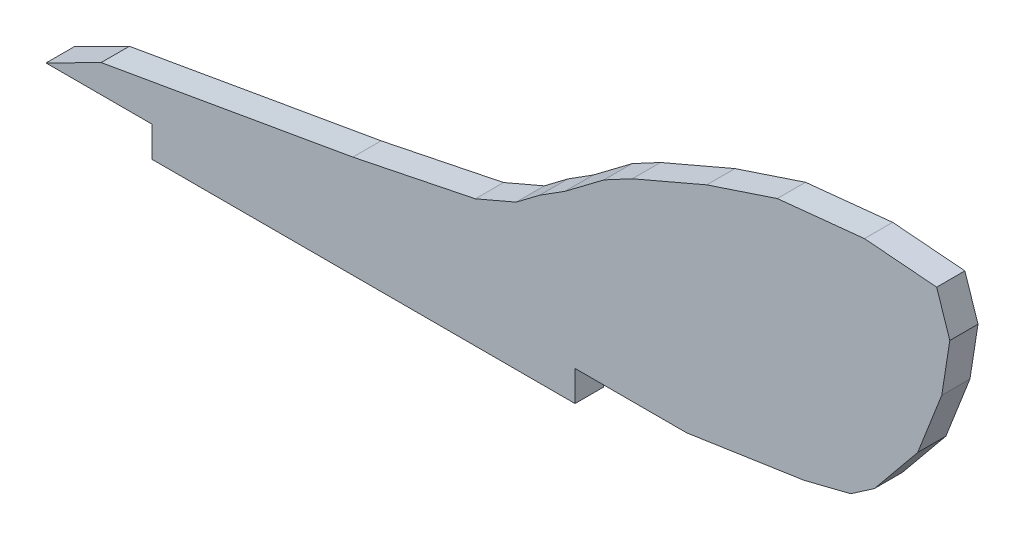
ISO-10303-21;
HEADER;
FILE_DESCRIPTION(('STEP AP214'),'2;1');
FILE_NAME('part.step','',(''),(''),'','','');
FILE_SCHEMA(('AUTOMOTIVE_DESIGN { 1 0 10303 214 1 1 1 1 }'));
ENDSEC;
DATA;
#1=APPLICATION_CONTEXT('core data for automotive mechanical design processes');
#2=APPLICATION_PROTOCOL_DEFINITION('international standard','automotive_design',2000,#1);
#3=PRODUCT_CONTEXT('',#1,'mechanical');
#4=PRODUCT('Part','Part','',(#3));
#5=PRODUCT_RELATED_PRODUCT_CATEGORY('part','',(#4));
#6=PRODUCT_DEFINITION_FORMATION('','',#4);
#7=PRODUCT_DEFINITION_CONTEXT('part definition',#1,'design');
#8=PRODUCT_DEFINITION('design','',#6,#7);
#9=PRODUCT_DEFINITION_SHAPE('','',#8);
#10=(LENGTH_UNIT() NAMED_UNIT(*) SI_UNIT(.MILLI.,.METRE.));
#11=(NAMED_UNIT(*) PLANE_ANGLE_UNIT() SI_UNIT($,.RADIAN.));
#12=(NAMED_UNIT(*) SI_UNIT($,.STERADIAN.) SOLID_ANGLE_UNIT());
#13=UNCERTAINTY_MEASURE_WITH_UNIT(LENGTH_MEASURE(1.E-05),#10,'distance_accuracy_value','');
#14=(GEOMETRIC_REPRESENTATION_CONTEXT(3) GLOBAL_UNCERTAINTY_ASSIGNED_CONTEXT((#13)) GLOBAL_UNIT_ASSIGNED_CONTEXT((#10,
#11,#12)) REPRESENTATION_CONTEXT('',''));
#15=CARTESIAN_POINT('',(0.,0.,0.));
#16=DIRECTION('',(0.,0.,1.));
#17=DIRECTION('',(1.,0.,0.));
#18=AXIS2_PLACEMENT_3D('',#15,#16,#17);
#19=CARTESIAN_POINT('',(0.,0.,5.08));
#20=DIRECTION('',(0.,1.,0.));
#21=DIRECTION('',(0.,0.,1.));
#22=AXIS2_PLACEMENT_3D('',#19,#20,#21);
#23=PLANE('',#22);
#24=DIRECTION('',(1.,0.,0.));
#25=VECTOR('',#24,1.);
#26=CARTESIAN_POINT('',(0.,0.,0.));
#27=LINE('',#26,#25);
#28=CARTESIAN_POINT('',(0.,0.,0.));
#29=VERTEX_POINT('',#28);
#30=CARTESIAN_POINT('',(19.0754,0.,0.));
#31=VERTEX_POINT('',#30);
#32=EDGE_CURVE('E225',#29,#31,#27,.T.);
#33=ORIENTED_EDGE('',*,*,#32,.T.);
#34=DIRECTION('',(0.,0.,-1.));
#35=VECTOR('',#34,1.);
#36=CARTESIAN_POINT('',(19.0754,0.,5.08));
#37=LINE('',#36,#35);
#38=CARTESIAN_POINT('',(19.0754,0.,5.08));
#39=VERTEX_POINT('',#38);
#40=EDGE_CURVE('E11',#39,#31,#37,.T.);
#41=ORIENTED_EDGE('',*,*,#40,.F.);
#42=DIRECTION('',(1.,0.,0.));
#43=VECTOR('',#42,1.);
#44=CARTESIAN_POINT('',(0.,0.,5.08));
#45=LINE('',#44,#43);
#46=CARTESIAN_POINT('',(0.,0.,5.08));
#47=VERTEX_POINT('',#46);
#48=EDGE_CURVE('E271',#47,#39,#45,.T.);
#49=ORIENTED_EDGE('',*,*,#48,.F.);
#50=DIRECTION('',(0.,0.,-1.));
#51=VECTOR('',#50,1.);
#52=CARTESIAN_POINT('',(0.,0.,5.08));
#53=LINE('',#52,#51);
#54=EDGE_CURVE('E221',#47,#29,#53,.T.);
#55=ORIENTED_EDGE('',*,*,#54,.T.);
#56=EDGE_LOOP('',(#33,#41,#49,#55));
#57=FACE_BOUND('',#56,.T.);
#58=ADVANCED_FACE('F33',(#57),#23,.F.);
#59=CARTESIAN_POINT('',(19.0754,0.,5.08));
#60=DIRECTION('',(1.,0.,0.));
#61=DIRECTION('',(0.,0.,-1.));
#62=AXIS2_PLACEMENT_3D('',#59,#60,#61);
#63=PLANE('',#62);
#64=DIRECTION('',(0.,-1.,0.));
#65=VECTOR('',#64,1.);
#66=CARTESIAN_POINT('',(19.0754,0.,0.));
#67=LINE('',#66,#65);
#68=CARTESIAN_POINT('',(19.0754,-5.4864,0.));
#69=VERTEX_POINT('',#68);
#70=EDGE_CURVE('E228',#31,#69,#67,.T.);
#71=ORIENTED_EDGE('',*,*,#70,.T.);
#72=DIRECTION('',(0.,0.,-1.));
#73=VECTOR('',#72,1.);
#74=CARTESIAN_POINT('',(19.0754,-5.4864,5.08));
#75=LINE('',#74,#73);
#76=CARTESIAN_POINT('',(19.0754,-5.4864,5.08));
#77=VERTEX_POINT('',#76);
#78=EDGE_CURVE('E41',#77,#69,#75,.T.);
#79=ORIENTED_EDGE('',*,*,#78,.F.);
#80=DIRECTION('',(0.,-1.,0.));
#81=VECTOR('',#80,1.);
#82=CARTESIAN_POINT('',(19.0754,0.,5.08));
#83=LINE('',#82,#81);
#84=EDGE_CURVE('E140',#39,#77,#83,.T.);
#85=ORIENTED_EDGE('',*,*,#84,.F.);
#86=ORIENTED_EDGE('',*,*,#40,.T.);
#87=EDGE_LOOP('',(#71,#79,#85,#86));
#88=FACE_BOUND('',#87,.T.);
#89=ADVANCED_FACE('F409',(#88),#63,.F.);
#90=CARTESIAN_POINT('',(19.0754,-5.4864,5.08));
#91=DIRECTION('',(0.,1.,0.));
#92=DIRECTION('',(0.,0.,1.));
#93=AXIS2_PLACEMENT_3D('',#90,#91,#92);
#94=PLANE('',#93);
#95=DIRECTION('',(1.,0.,0.));
#96=VECTOR('',#95,1.);
#97=CARTESIAN_POINT('',(19.0754,-5.4864,0.));
#98=LINE('',#97,#96);
#99=CARTESIAN_POINT('',(95.2754,-5.4864,0.));
#100=VERTEX_POINT('',#99);
#101=EDGE_CURVE('E230',#69,#100,#98,.T.);
#102=ORIENTED_EDGE('',*,*,#101,.T.);
#103=DIRECTION('',(0.,0.,-1.));
#104=VECTOR('',#103,1.);
#105=CARTESIAN_POINT('',(95.2754,-5.4864,5.08));
#106=LINE('',#105,#104);
#107=CARTESIAN_POINT('',(95.2754,-5.4864,5.08));
#108=VERTEX_POINT('',#107);
#109=EDGE_CURVE('E326',#108,#100,#106,.T.);
#110=ORIENTED_EDGE('',*,*,#109,.F.);
#111=DIRECTION('',(1.,0.,0.));
#112=VECTOR('',#111,1.);
#113=CARTESIAN_POINT('',(19.0754,-5.4864,5.08));
#114=LINE('',#113,#112);
#115=EDGE_CURVE('E334',#77,#108,#114,.T.);
#116=ORIENTED_EDGE('',*,*,#115,.F.);
#117=ORIENTED_EDGE('',*,*,#78,.T.);
#118=EDGE_LOOP('',(#102,#110,#116,#117));
#119=FACE_BOUND('',#118,.T.);
#120=ADVANCED_FACE('F332',(#119),#94,.F.);
#121=CARTESIAN_POINT('',(95.2754,-5.4864,5.08));
#122=DIRECTION('',(-1.,0.,0.));
#123=DIRECTION('',(0.,0.,1.));
#124=AXIS2_PLACEMENT_3D('',#121,#122,#123);
#125=PLANE('',#124);
#126=DIRECTION('',(0.,1.,0.));
#127=VECTOR('',#126,1.);
#128=CARTESIAN_POINT('',(95.2754,-5.4864,0.));
#129=LINE('',#128,#127);
#130=CARTESIAN_POINT('',(95.2754,0.,0.));
#131=VERTEX_POINT('',#130);
#132=EDGE_CURVE('E232',#100,#131,#129,.T.);
#133=ORIENTED_EDGE('',*,*,#132,.T.);
#134=DIRECTION('',(0.,0.,-1.));
#135=VECTOR('',#134,1.);
#136=CARTESIAN_POINT('',(95.2754,0.,5.08));
#137=LINE('',#136,#135);
#138=CARTESIAN_POINT('',(95.2754,0.,5.08));
#139=VERTEX_POINT('',#138);
#140=EDGE_CURVE('E323',#139,#131,#137,.T.);
#141=ORIENTED_EDGE('',*,*,#140,.F.);
#142=DIRECTION('',(0.,1.,0.));
#143=VECTOR('',#142,1.);
#144=CARTESIAN_POINT('',(95.2754,-5.4864,5.08));
#145=LINE('',#144,#143);
#146=EDGE_CURVE('E352',#108,#139,#145,.T.);
#147=ORIENTED_EDGE('',*,*,#146,.F.);
#148=ORIENTED_EDGE('',*,*,#109,.T.);
#149=EDGE_LOOP('',(#133,#141,#147,#148));
#150=FACE_BOUND('',#149,.T.);
#151=ADVANCED_FACE('F343',(#150),#125,.F.);
#152=CARTESIAN_POINT('',(95.2754,0.,5.08));
#153=DIRECTION('',(0.,1.,0.));
#154=DIRECTION('',(0.,0.,1.));
#155=AXIS2_PLACEMENT_3D('',#152,#153,#154);
#156=PLANE('',#155);
#157=DIRECTION('',(1.,0.,0.));
#158=VECTOR('',#157,1.);
#159=CARTESIAN_POINT('',(95.2754,0.,0.));
#160=LINE('',#159,#158);
#161=CARTESIAN_POINT('',(115.3922,0.,0.));
#162=VERTEX_POINT('',#161);
#163=EDGE_CURVE('E234',#131,#162,#160,.T.);
#164=ORIENTED_EDGE('',*,*,#163,.T.);
#165=DIRECTION('',(0.,0.,-1.));
#166=VECTOR('',#165,1.);
#167=CARTESIAN_POINT('',(115.3922,0.,5.08));
#168=LINE('',#167,#166);
#169=CARTESIAN_POINT('',(115.3922,0.,5.08));
#170=VERTEX_POINT('',#169);
#171=EDGE_CURVE('E320',#170,#162,#168,.T.);
#172=ORIENTED_EDGE('',*,*,#171,.F.);
#173=DIRECTION('',(1.,0.,0.));
#174=VECTOR('',#173,1.);
#175=CARTESIAN_POINT('',(95.2754,0.,5.08));
#176=LINE('',#175,#174);
#177=EDGE_CURVE('E349',#139,#170,#176,.T.);
#178=ORIENTED_EDGE('',*,*,#177,.F.);
#179=ORIENTED_EDGE('',*,*,#140,.T.);
#180=EDGE_LOOP('',(#164,#172,#178,#179));
#181=FACE_BOUND('',#180,.T.);
#182=ADVANCED_FACE('F347',(#181),#156,.F.);
#183=CARTESIAN_POINT('',(136.5504,3.175,5.08));
#184=DIRECTION('',(-0.148398505879888,0.988927643183573,0.));
#185=DIRECTION('',(-0.988927643183573,-0.148398505879888,0.));
#186=AXIS2_PLACEMENT_3D('',#183,#184,#185);
#187=PLANE('',#186);
#188=DIRECTION('',(0.988927643183573,0.148398505879888,0.));
#189=VECTOR('',#188,1.);
#190=CARTESIAN_POINT('',(136.5504,3.175,0.));
#191=LINE('',#190,#189);
#192=CARTESIAN_POINT('',(136.5504,3.175,0.));
#193=VERTEX_POINT('',#192);
#194=EDGE_CURVE('E236',#162,#193,#191,.T.);
#195=ORIENTED_EDGE('',*,*,#194,.T.);
#196=DIRECTION('',(0.,0.,-1.));
#197=VECTOR('',#196,1.);
#198=CARTESIAN_POINT('',(136.5504,3.175,5.08));
#199=LINE('',#198,#197);
#200=CARTESIAN_POINT('',(136.5504,3.175,5.08));
#201=VERTEX_POINT('',#200);
#202=EDGE_CURVE('E317',#201,#193,#199,.T.);
#203=ORIENTED_EDGE('',*,*,#202,.F.);
#204=DIRECTION('',(0.988927643183573,0.148398505879888,0.));
#205=VECTOR('',#204,1.);
#206=CARTESIAN_POINT('',(136.5504,3.175,5.08));
#207=LINE('',#206,#205);
#208=EDGE_CURVE('E351',#170,#201,#207,.T.);
#209=ORIENTED_EDGE('',*,*,#208,.F.);
#210=ORIENTED_EDGE('',*,*,#171,.T.);
#211=EDGE_LOOP('',(#195,#203,#209,#210));
#212=FACE_BOUND('',#211,.T.);
#213=ADVANCED_FACE('F422',(#212),#187,.F.);
#214=CARTESIAN_POINT('',(144.9324,5.2832,5.08));
#215=DIRECTION('',(-0.243918331587152,0.969795776189884,0.));
#216=DIRECTION('',(-0.969795776189884,-0.243918331587153,0.));
#217=AXIS2_PLACEMENT_3D('',#214,#215,#216);
#218=PLANE('',#217);
#219=DIRECTION('',(0.969795776189884,0.243918331587153,0.));
#220=VECTOR('',#219,1.);
#221=CARTESIAN_POINT('',(144.9324,5.2832,0.));
#222=LINE('',#221,#220);
#223=CARTESIAN_POINT('',(144.9324,5.2832,0.));
#224=VERTEX_POINT('',#223);
#225=EDGE_CURVE('E238',#193,#224,#222,.T.);
#226=ORIENTED_EDGE('',*,*,#225,.T.);
#227=DIRECTION('',(0.,0.,-1.));
#228=VECTOR('',#227,1.);
#229=CARTESIAN_POINT('',(144.9324,5.2832,5.08));
#230=LINE('',#229,#228);
#231=CARTESIAN_POINT('',(144.9324,5.2832,5.08));
#232=VERTEX_POINT('',#231);
#233=EDGE_CURVE('E314',#232,#224,#230,.T.);
#234=ORIENTED_EDGE('',*,*,#233,.F.);
#235=DIRECTION('',(0.969795776189884,0.243918331587153,0.));
#236=VECTOR('',#235,1.);
#237=CARTESIAN_POINT('',(144.9324,5.2832,5.08));
#238=LINE('',#237,#236);
#239=EDGE_CURVE('E354',#201,#232,#238,.T.);
#240=ORIENTED_EDGE('',*,*,#239,.F.);
#241=ORIENTED_EDGE('',*,*,#202,.T.);
#242=EDGE_LOOP('',(#226,#234,#240,#241));
#243=FACE_BOUND('',#242,.T.);
#244=ADVANCED_FACE('F425',(#243),#218,.F.);
#245=CARTESIAN_POINT('',(149.1742,8.2042,5.08));
#246=DIRECTION('',(-0.567156579430481,0.823609989259914,0.));
#247=DIRECTION('',(-0.823609989259914,-0.567156579430481,0.));
#248=AXIS2_PLACEMENT_3D('',#245,#246,#247);
#249=PLANE('',#248);
#250=DIRECTION('',(0.823609989259914,0.567156579430481,0.));
#251=VECTOR('',#250,1.);
#252=CARTESIAN_POINT('',(149.1742,8.2042,0.));
#253=LINE('',#252,#251);
#254=CARTESIAN_POINT('',(149.1742,8.2042,0.));
#255=VERTEX_POINT('',#254);
#256=EDGE_CURVE('E240',#224,#255,#253,.T.);
#257=ORIENTED_EDGE('',*,*,#256,.T.);
#258=DIRECTION('',(0.,0.,-1.));
#259=VECTOR('',#258,1.);
#260=CARTESIAN_POINT('',(149.1742,8.2042,5.08));
#261=LINE('',#260,#259);
#262=CARTESIAN_POINT('',(149.1742,8.2042,5.08));
#263=VERTEX_POINT('',#262);
#264=EDGE_CURVE('E311',#263,#255,#261,.T.);
#265=ORIENTED_EDGE('',*,*,#264,.F.);
#266=DIRECTION('',(0.823609989259914,0.567156579430481,0.));
#267=VECTOR('',#266,1.);
#268=CARTESIAN_POINT('',(149.1742,8.2042,5.08));
#269=LINE('',#268,#267);
#270=EDGE_CURVE('E360',#232,#263,#269,.T.);
#271=ORIENTED_EDGE('',*,*,#270,.F.);
#272=ORIENTED_EDGE('',*,*,#233,.T.);
#273=EDGE_LOOP('',(#257,#265,#271,#272));
#274=FACE_BOUND('',#273,.T.);
#275=ADVANCED_FACE('F429',(#274),#249,.F.);
#276=CARTESIAN_POINT('',(156.972,17.7292,5.08));
#277=DIRECTION('',(-0.77377339963111,0.633462489831335,0.));
#278=DIRECTION('',(-0.633462489831335,-0.77377339963111,0.));
#279=AXIS2_PLACEMENT_3D('',#276,#277,#278);
#280=PLANE('',#279);
#281=DIRECTION('',(0.633462489831335,0.77377339963111,0.));
#282=VECTOR('',#281,1.);
#283=CARTESIAN_POINT('',(156.972,17.7292,0.));
#284=LINE('',#283,#282);
#285=CARTESIAN_POINT('',(156.972,17.7292,0.));
#286=VERTEX_POINT('',#285);
#287=EDGE_CURVE('E242',#255,#286,#284,.T.);
#288=ORIENTED_EDGE('',*,*,#287,.T.);
#289=DIRECTION('',(0.,0.,-1.));
#290=VECTOR('',#289,1.);
#291=CARTESIAN_POINT('',(156.972,17.7292,5.08));
#292=LINE('',#291,#290);
#293=CARTESIAN_POINT('',(156.972,17.7292,5.08));
#294=VERTEX_POINT('',#293);
#295=EDGE_CURVE('E308',#294,#286,#292,.T.);
#296=ORIENTED_EDGE('',*,*,#295,.F.);
#297=DIRECTION('',(0.633462489831335,0.77377339963111,0.));
#298=VECTOR('',#297,1.);
#299=CARTESIAN_POINT('',(156.972,17.7292,5.08));
#300=LINE('',#299,#298);
#301=EDGE_CURVE('E362',#263,#294,#300,.T.);
#302=ORIENTED_EDGE('',*,*,#301,.F.);
#303=ORIENTED_EDGE('',*,*,#264,.T.);
#304=EDGE_LOOP('',(#288,#296,#302,#303));
#305=FACE_BOUND('',#304,.T.);
#306=ADVANCED_FACE('F433',(#305),#280,.F.);
#307=CARTESIAN_POINT('',(161.3154,28.829,5.08));
#308=DIRECTION('',(-0.931242779705753,0.364399348580512,0.));
#309=DIRECTION('',(-0.364399348580512,-0.931242779705754,0.));
#310=AXIS2_PLACEMENT_3D('',#307,#308,#309);
#311=PLANE('',#310);
#312=DIRECTION('',(0.364399348580512,0.931242779705754,0.));
#313=VECTOR('',#312,1.);
#314=CARTESIAN_POINT('',(161.3154,28.829,0.));
#315=LINE('',#314,#313);
#316=CARTESIAN_POINT('',(161.3154,28.829,0.));
#317=VERTEX_POINT('',#316);
#318=EDGE_CURVE('E244',#286,#317,#315,.T.);
#319=ORIENTED_EDGE('',*,*,#318,.T.);
#320=DIRECTION('',(0.,0.,-1.));
#321=VECTOR('',#320,1.);
#322=CARTESIAN_POINT('',(161.3154,28.829,5.08));
#323=LINE('',#322,#321);
#324=CARTESIAN_POINT('',(161.3154,28.829,5.08));
#325=VERTEX_POINT('',#324);
#326=EDGE_CURVE('E305',#325,#317,#323,.T.);
#327=ORIENTED_EDGE('',*,*,#326,.F.);
#328=DIRECTION('',(0.364399348580512,0.931242779705754,0.));
#329=VECTOR('',#328,1.);
#330=CARTESIAN_POINT('',(161.3154,28.829,5.08));
#331=LINE('',#330,#329);
#332=EDGE_CURVE('E364',#294,#325,#331,.T.);
#333=ORIENTED_EDGE('',*,*,#332,.F.);
#334=ORIENTED_EDGE('',*,*,#295,.T.);
#335=EDGE_LOOP('',(#319,#327,#333,#334));
#336=FACE_BOUND('',#335,.T.);
#337=ADVANCED_FACE('F437',(#336),#311,.F.);
#338=CARTESIAN_POINT('',(162.7632,38.1,5.08));
#339=DIRECTION('',(-0.9880249326723,0.154294304554304,0.));
#340=DIRECTION('',(-0.154294304554304,-0.9880249326723,0.));
#341=AXIS2_PLACEMENT_3D('',#338,#339,#340);
#342=PLANE('',#341);
#343=DIRECTION('',(0.154294304554304,0.9880249326723,0.));
#344=VECTOR('',#343,1.);
#345=CARTESIAN_POINT('',(162.7632,38.1,0.));
#346=LINE('',#345,#344);
#347=CARTESIAN_POINT('',(162.7632,38.1,0.));
#348=VERTEX_POINT('',#347);
#349=EDGE_CURVE('E246',#317,#348,#346,.T.);
#350=ORIENTED_EDGE('',*,*,#349,.T.);
#351=DIRECTION('',(0.,0.,-1.));
#352=VECTOR('',#351,1.);
#353=CARTESIAN_POINT('',(162.7632,38.1,5.08));
#354=LINE('',#353,#352);
#355=CARTESIAN_POINT('',(162.7632,38.1,5.08));
#356=VERTEX_POINT('',#355);
#357=EDGE_CURVE('E302',#356,#348,#354,.T.);
#358=ORIENTED_EDGE('',*,*,#357,.F.);
#359=DIRECTION('',(0.154294304554304,0.9880249326723,0.));
#360=VECTOR('',#359,1.);
#361=CARTESIAN_POINT('',(162.7632,38.1,5.08));
#362=LINE('',#361,#360);
#363=EDGE_CURVE('E366',#325,#356,#362,.T.);
#364=ORIENTED_EDGE('',*,*,#363,.F.);
#365=ORIENTED_EDGE('',*,*,#326,.T.);
#366=EDGE_LOOP('',(#350,#358,#364,#365));
#367=FACE_BOUND('',#366,.T.);
#368=ADVANCED_FACE('F441',(#367),#342,.F.);
#369=CARTESIAN_POINT('',(160.400999981411,45.2374000015249,5.08));
#370=DIRECTION('',(-0.949356830446367,-0.314199949848544,0.));
#371=DIRECTION('',(0.314199949848544,-0.949356830446367,0.));
#372=AXIS2_PLACEMENT_3D('',#369,#370,#371);
#373=PLANE('',#372);
#374=DIRECTION('',(-0.314199949848544,0.949356830446367,0.));
#375=VECTOR('',#374,1.);
#376=CARTESIAN_POINT('',(160.400999981411,45.2374000015249,0.));
#377=LINE('',#376,#375);
#378=CARTESIAN_POINT('',(160.400999981411,45.2374000015249,0.));
#379=VERTEX_POINT('',#378);
#380=EDGE_CURVE('E248',#348,#379,#377,.T.);
#381=ORIENTED_EDGE('',*,*,#380,.T.);
#382=DIRECTION('',(0.,0.,-1.));
#383=VECTOR('',#382,1.);
#384=CARTESIAN_POINT('',(160.400999981411,45.2374000015249,5.08));
#385=LINE('',#384,#383);
#386=CARTESIAN_POINT('',(160.400999981411,45.2374000015249,5.08));
#387=VERTEX_POINT('',#386);
#388=EDGE_CURVE('E299',#387,#379,#385,.T.);
#389=ORIENTED_EDGE('',*,*,#388,.F.);
#390=DIRECTION('',(-0.314199949848544,0.949356830446367,0.));
#391=VECTOR('',#390,1.);
#392=CARTESIAN_POINT('',(160.400999981411,45.2374000015249,5.08));
#393=LINE('',#392,#391);
#394=EDGE_CURVE('E368',#356,#387,#393,.T.);
#395=ORIENTED_EDGE('',*,*,#394,.F.);
#396=ORIENTED_EDGE('',*,*,#357,.T.);
#397=EDGE_LOOP('',(#381,#389,#395,#396));
#398=FACE_BOUND('',#397,.T.);
#399=ADVANCED_FACE('F445',(#398),#373,.F.);
#400=CARTESIAN_POINT('',(147.3962,46.3042,5.08));
#401=DIRECTION('',(-0.0817566358526895,-0.996652322775626,0.));
#402=DIRECTION('',(0.996652322775626,-0.0817566358526895,0.));
#403=AXIS2_PLACEMENT_3D('',#400,#401,#402);
#404=PLANE('',#403);
#405=DIRECTION('',(-0.996652322775626,0.0817566358526894,0.));
#406=VECTOR('',#405,1.);
#407=CARTESIAN_POINT('',(147.3962,46.3042,0.));
#408=LINE('',#407,#406);
#409=CARTESIAN_POINT('',(147.3962,46.3042,0.));
#410=VERTEX_POINT('',#409);
#411=EDGE_CURVE('E250',#379,#410,#408,.T.);
#412=ORIENTED_EDGE('',*,*,#411,.T.);
#413=DIRECTION('',(0.,0.,-1.));
#414=VECTOR('',#413,1.);
#415=CARTESIAN_POINT('',(147.3962,46.3042,5.08));
#416=LINE('',#415,#414);
#417=CARTESIAN_POINT('',(147.3962,46.3042,5.08));
#418=VERTEX_POINT('',#417);
#419=EDGE_CURVE('E296',#418,#410,#416,.T.);
#420=ORIENTED_EDGE('',*,*,#419,.F.);
#421=DIRECTION('',(-0.996652322775626,0.0817566358526894,0.));
#422=VECTOR('',#421,1.);
#423=CARTESIAN_POINT('',(147.3962,46.3042,5.08));
#424=LINE('',#423,#422);
#425=EDGE_CURVE('E370',#387,#418,#424,.T.);
#426=ORIENTED_EDGE('',*,*,#425,.F.);
#427=ORIENTED_EDGE('',*,*,#388,.T.);
#428=EDGE_LOOP('',(#412,#420,#426,#427));
#429=FACE_BOUND('',#428,.T.);
#430=ADVANCED_FACE('F449',(#429),#404,.F.);
#431=CARTESIAN_POINT('',(131.699,44.704,5.08));
#432=DIRECTION('',(0.101416145203864,-0.994844091047431,0.));
#433=DIRECTION('',(0.994844091047431,0.101416145203864,0.));
#434=AXIS2_PLACEMENT_3D('',#431,#432,#433);
#435=PLANE('',#434);
#436=DIRECTION('',(-0.994844091047431,-0.101416145203864,0.));
#437=VECTOR('',#436,1.);
#438=CARTESIAN_POINT('',(131.699,44.704,0.));
#439=LINE('',#438,#437);
#440=CARTESIAN_POINT('',(131.699,44.704,0.));
#441=VERTEX_POINT('',#440);
#442=EDGE_CURVE('E252',#410,#441,#439,.T.);
#443=ORIENTED_EDGE('',*,*,#442,.T.);
#444=DIRECTION('',(0.,0.,-1.));
#445=VECTOR('',#444,1.);
#446=CARTESIAN_POINT('',(131.699,44.704,5.08));
#447=LINE('',#446,#445);
#448=CARTESIAN_POINT('',(131.699,44.704,5.08));
#449=VERTEX_POINT('',#448);
#450=EDGE_CURVE('E293',#449,#441,#447,.T.);
#451=ORIENTED_EDGE('',*,*,#450,.F.);
#452=DIRECTION('',(-0.994844091047431,-0.101416145203864,0.));
#453=VECTOR('',#452,1.);
#454=CARTESIAN_POINT('',(131.699,44.704,5.08));
#455=LINE('',#454,#453);
#456=EDGE_CURVE('E372',#418,#449,#455,.T.);
#457=ORIENTED_EDGE('',*,*,#456,.F.);
#458=ORIENTED_EDGE('',*,*,#419,.T.);
#459=EDGE_LOOP('',(#443,#451,#457,#458));
#460=FACE_BOUND('',#459,.T.);
#461=ADVANCED_FACE('F453',(#460),#435,.F.);
#462=CARTESIAN_POINT('',(118.999,40.4876,5.08));
#463=DIRECTION('',(0.315088663463618,-0.949062239348248,0.));
#464=DIRECTION('',(0.949062239348248,0.315088663463618,0.));
#465=AXIS2_PLACEMENT_3D('',#462,#463,#464);
#466=PLANE('',#465);
#467=DIRECTION('',(-0.949062239348248,-0.315088663463618,0.));
#468=VECTOR('',#467,1.);
#469=CARTESIAN_POINT('',(118.999,40.4876,0.));
#470=LINE('',#469,#468);
#471=CARTESIAN_POINT('',(118.999,40.4876,0.));
#472=VERTEX_POINT('',#471);
#473=EDGE_CURVE('E254',#441,#472,#470,.T.);
#474=ORIENTED_EDGE('',*,*,#473,.T.);
#475=DIRECTION('',(0.,0.,-1.));
#476=VECTOR('',#475,1.);
#477=CARTESIAN_POINT('',(118.999,40.4876,5.08));
#478=LINE('',#477,#476);
#479=CARTESIAN_POINT('',(118.999,40.4876,5.08));
#480=VERTEX_POINT('',#479);
#481=EDGE_CURVE('E290',#480,#472,#478,.T.);
#482=ORIENTED_EDGE('',*,*,#481,.F.);
#483=DIRECTION('',(-0.949062239348248,-0.315088663463618,0.));
#484=VECTOR('',#483,1.);
#485=CARTESIAN_POINT('',(118.999,40.4876,5.08));
#486=LINE('',#485,#484);
#487=EDGE_CURVE('E374',#449,#480,#486,.T.);
#488=ORIENTED_EDGE('',*,*,#487,.F.);
#489=ORIENTED_EDGE('',*,*,#450,.T.);
#490=EDGE_LOOP('',(#474,#482,#488,#489));
#491=FACE_BOUND('',#490,.T.);
#492=ADVANCED_FACE('F457',(#491),#466,.F.);
#493=CARTESIAN_POINT('',(105.590652807882,34.7345375369458,5.08));
#494=DIRECTION('',(0.3943030408389,-0.918980474213243,0.));
#495=DIRECTION('',(0.918980474213243,0.3943030408389,0.));
#496=AXIS2_PLACEMENT_3D('',#493,#494,#495);
#497=PLANE('',#496);
#498=DIRECTION('',(-0.918980474213243,-0.3943030408389,0.));
#499=VECTOR('',#498,1.);
#500=CARTESIAN_POINT('',(105.590652807882,34.7345375369458,0.));
#501=LINE('',#500,#499);
#502=CARTESIAN_POINT('',(105.590652807882,34.7345375369458,0.));
#503=VERTEX_POINT('',#502);
#504=EDGE_CURVE('E256',#472,#503,#501,.T.);
#505=ORIENTED_EDGE('',*,*,#504,.T.);
#506=DIRECTION('',(0.,0.,-1.));
#507=VECTOR('',#506,1.);
#508=CARTESIAN_POINT('',(105.590652807882,34.7345375369458,5.08));
#509=LINE('',#508,#507);
#510=CARTESIAN_POINT('',(105.590652807882,34.7345375369458,5.08));
#511=VERTEX_POINT('',#510);
#512=EDGE_CURVE('E287',#511,#503,#509,.T.);
#513=ORIENTED_EDGE('',*,*,#512,.F.);
#514=DIRECTION('',(-0.918980474213243,-0.3943030408389,0.));
#515=VECTOR('',#514,1.);
#516=CARTESIAN_POINT('',(105.590652807882,34.7345375369458,5.08));
#517=LINE('',#516,#515);
#518=EDGE_CURVE('E376',#480,#511,#517,.T.);
#519=ORIENTED_EDGE('',*,*,#518,.F.);
#520=ORIENTED_EDGE('',*,*,#481,.T.);
#521=EDGE_LOOP('',(#505,#513,#519,#520));
#522=FACE_BOUND('',#521,.T.);
#523=ADVANCED_FACE('F461',(#522),#497,.F.);
#524=CARTESIAN_POINT('',(100.4824,32.004,5.08));
#525=DIRECTION('',(0.47141278673879,-0.881912685303465,0.));
#526=DIRECTION('',(0.881912685303465,0.47141278673879,0.));
#527=AXIS2_PLACEMENT_3D('',#524,#525,#526);
#528=PLANE('',#527);
#529=DIRECTION('',(-0.881912685303465,-0.47141278673879,0.));
#530=VECTOR('',#529,1.);
#531=CARTESIAN_POINT('',(100.4824,32.004,0.));
#532=LINE('',#531,#530);
#533=CARTESIAN_POINT('',(100.4824,32.004,0.));
#534=VERTEX_POINT('',#533);
#535=EDGE_CURVE('E258',#503,#534,#532,.T.);
#536=ORIENTED_EDGE('',*,*,#535,.T.);
#537=DIRECTION('',(0.,0.,-1.));
#538=VECTOR('',#537,1.);
#539=CARTESIAN_POINT('',(100.4824,32.004,5.08));
#540=LINE('',#539,#538);
#541=CARTESIAN_POINT('',(100.4824,32.004,5.08));
#542=VERTEX_POINT('',#541);
#543=EDGE_CURVE('E284',#542,#534,#540,.T.);
#544=ORIENTED_EDGE('',*,*,#543,.F.);
#545=DIRECTION('',(-0.881912685303465,-0.47141278673879,0.));
#546=VECTOR('',#545,1.);
#547=CARTESIAN_POINT('',(100.4824,32.004,5.08));
#548=LINE('',#547,#546);
#549=EDGE_CURVE('E378',#511,#542,#548,.T.);
#550=ORIENTED_EDGE('',*,*,#549,.F.);
#551=ORIENTED_EDGE('',*,*,#512,.T.);
#552=EDGE_LOOP('',(#536,#544,#550,#551));
#553=FACE_BOUND('',#552,.T.);
#554=ADVANCED_FACE('F465',(#553),#528,.F.);
#555=CARTESIAN_POINT('',(93.472,26.7208,5.08));
#556=DIRECTION('',(0.601850239386592,-0.798608971493748,0.));
#557=DIRECTION('',(0.798608971493748,0.601850239386592,0.));
#558=AXIS2_PLACEMENT_3D('',#555,#556,#557);
#559=PLANE('',#558);
#560=DIRECTION('',(-0.798608971493748,-0.601850239386592,0.));
#561=VECTOR('',#560,1.);
#562=CARTESIAN_POINT('',(93.472,26.7208,0.));
#563=LINE('',#562,#561);
#564=CARTESIAN_POINT('',(93.472,26.7208,0.));
#565=VERTEX_POINT('',#564);
#566=EDGE_CURVE('E260',#534,#565,#563,.T.);
#567=ORIENTED_EDGE('',*,*,#566,.T.);
#568=DIRECTION('',(0.,0.,-1.));
#569=VECTOR('',#568,1.);
#570=CARTESIAN_POINT('',(93.472,26.7208,5.08));
#571=LINE('',#570,#569);
#572=CARTESIAN_POINT('',(93.472,26.7208,5.08));
#573=VERTEX_POINT('',#572);
#574=EDGE_CURVE('E281',#573,#565,#571,.T.);
#575=ORIENTED_EDGE('',*,*,#574,.F.);
#576=DIRECTION('',(-0.798608971493748,-0.601850239386592,0.));
#577=VECTOR('',#576,1.);
#578=CARTESIAN_POINT('',(93.472,26.7208,5.08));
#579=LINE('',#578,#577);
#580=EDGE_CURVE('E380',#542,#573,#579,.T.);
#581=ORIENTED_EDGE('',*,*,#580,.F.);
#582=ORIENTED_EDGE('',*,*,#543,.T.);
#583=EDGE_LOOP('',(#567,#575,#581,#582));
#584=FACE_BOUND('',#583,.T.);
#585=ADVANCED_FACE('F469',(#584),#559,.F.);
#586=CARTESIAN_POINT('',(88.9,23.8252,5.08));
#587=DIRECTION('',(0.535052081184344,-0.844819075554229,0.));
#588=DIRECTION('',(0.844819075554229,0.535052081184344,0.));
#589=AXIS2_PLACEMENT_3D('',#586,#587,#588);
#590=PLANE('',#589);
#591=DIRECTION('',(-0.844819075554229,-0.535052081184344,0.));
#592=VECTOR('',#591,1.);
#593=CARTESIAN_POINT('',(88.9,23.8252,0.));
#594=LINE('',#593,#592);
#595=CARTESIAN_POINT('',(88.9,23.8252,0.));
#596=VERTEX_POINT('',#595);
#597=EDGE_CURVE('E262',#565,#596,#594,.T.);
#598=ORIENTED_EDGE('',*,*,#597,.T.);
#599=DIRECTION('',(0.,0.,-1.));
#600=VECTOR('',#599,1.);
#601=CARTESIAN_POINT('',(88.9,23.8252,5.08));
#602=LINE('',#601,#600);
#603=CARTESIAN_POINT('',(88.9,23.8252,5.08));
#604=VERTEX_POINT('',#603);
#605=EDGE_CURVE('E278',#604,#596,#602,.T.);
#606=ORIENTED_EDGE('',*,*,#605,.F.);
#607=DIRECTION('',(-0.844819075554229,-0.535052081184344,0.));
#608=VECTOR('',#607,1.);
#609=CARTESIAN_POINT('',(88.9,23.8252,5.08));
#610=LINE('',#609,#608);
#611=EDGE_CURVE('E382',#573,#604,#610,.T.);
#612=ORIENTED_EDGE('',*,*,#611,.F.);
#613=ORIENTED_EDGE('',*,*,#574,.T.);
#614=EDGE_LOOP('',(#598,#606,#612,#613));
#615=FACE_BOUND('',#614,.T.);
#616=ADVANCED_FACE('F473',(#615),#590,.F.);
#617=CARTESIAN_POINT('',(84.6582,20.6248,5.08));
#618=DIRECTION('',(0.602291977899668,-0.798275875470194,0.));
#619=DIRECTION('',(0.798275875470195,0.602291977899668,0.));
#620=AXIS2_PLACEMENT_3D('',#617,#618,#619);
#621=PLANE('',#620);
#622=DIRECTION('',(-0.798275875470194,-0.602291977899668,0.));
#623=VECTOR('',#622,1.);
#624=CARTESIAN_POINT('',(84.6582,20.6248,0.));
#625=LINE('',#624,#623);
#626=CARTESIAN_POINT('',(84.6582,20.6248,0.));
#627=VERTEX_POINT('',#626);
#628=EDGE_CURVE('E264',#596,#627,#625,.T.);
#629=ORIENTED_EDGE('',*,*,#628,.T.);
#630=DIRECTION('',(0.,0.,-1.));
#631=VECTOR('',#630,1.);
#632=CARTESIAN_POINT('',(84.6582,20.6248,5.08));
#633=LINE('',#632,#631);
#634=CARTESIAN_POINT('',(84.6582,20.6248,5.08));
#635=VERTEX_POINT('',#634);
#636=EDGE_CURVE('E275',#635,#627,#633,.T.);
#637=ORIENTED_EDGE('',*,*,#636,.F.);
#638=DIRECTION('',(-0.798275875470194,-0.602291977899668,0.));
#639=VECTOR('',#638,1.);
#640=CARTESIAN_POINT('',(84.6582,20.6248,5.08));
#641=LINE('',#640,#639);
#642=EDGE_CURVE('E384',#604,#635,#641,.T.);
#643=ORIENTED_EDGE('',*,*,#642,.F.);
#644=ORIENTED_EDGE('',*,*,#605,.T.);
#645=EDGE_LOOP('',(#629,#637,#643,#644));
#646=FACE_BOUND('',#645,.T.);
#647=ADVANCED_FACE('F390',(#646),#621,.F.);
#648=CARTESIAN_POINT('',(77.3176,17.4752,5.08));
#649=DIRECTION('',(0.3943030408389,-0.918980474213243,0.));
#650=DIRECTION('',(0.918980474213243,0.3943030408389,0.));
#651=AXIS2_PLACEMENT_3D('',#648,#649,#650);
#652=PLANE('',#651);
#653=DIRECTION('',(-0.918980474213243,-0.3943030408389,0.));
#654=VECTOR('',#653,1.);
#655=CARTESIAN_POINT('',(77.3176,17.4752,0.));
#656=LINE('',#655,#654);
#657=CARTESIAN_POINT('',(77.3176,17.4752,0.));
#658=VERTEX_POINT('',#657);
#659=EDGE_CURVE('E266',#627,#658,#656,.T.);
#660=ORIENTED_EDGE('',*,*,#659,.T.);
#661=DIRECTION('',(0.,0.,-1.));
#662=VECTOR('',#661,1.);
#663=CARTESIAN_POINT('',(77.3176,17.4752,5.08));
#664=LINE('',#663,#662);
#665=CARTESIAN_POINT('',(77.3176,17.4752,5.08));
#666=VERTEX_POINT('',#665);
#667=EDGE_CURVE('E216',#666,#658,#664,.T.);
#668=ORIENTED_EDGE('',*,*,#667,.F.);
#669=DIRECTION('',(-0.918980474213243,-0.3943030408389,0.));
#670=VECTOR('',#669,1.);
#671=CARTESIAN_POINT('',(77.3176,17.4752,5.08));
#672=LINE('',#671,#670);
#673=EDGE_CURVE('E207',#635,#666,#672,.T.);
#674=ORIENTED_EDGE('',*,*,#673,.F.);
#675=ORIENTED_EDGE('',*,*,#636,.T.);
#676=EDGE_LOOP('',(#660,#668,#674,#675));
#677=FACE_BOUND('',#676,.T.);
#678=ADVANCED_FACE('F394',(#677),#652,.F.);
#679=CARTESIAN_POINT('',(55.2704,12.954,5.08));
#680=DIRECTION('',(0.20088860406857,-0.979614091750104,0.));
#681=DIRECTION('',(0.979614091750104,0.20088860406857,0.));
#682=AXIS2_PLACEMENT_3D('',#679,#680,#681);
#683=PLANE('',#682);
#684=DIRECTION('',(-0.979614091750104,-0.20088860406857,0.));
#685=VECTOR('',#684,1.);
#686=CARTESIAN_POINT('',(55.2704,12.954,0.));
#687=LINE('',#686,#685);
#688=CARTESIAN_POINT('',(55.2704,12.954,0.));
#689=VERTEX_POINT('',#688);
#690=EDGE_CURVE('E215',#658,#689,#687,.T.);
#691=ORIENTED_EDGE('',*,*,#690,.T.);
#692=DIRECTION('',(0.,0.,-1.));
#693=VECTOR('',#692,1.);
#694=CARTESIAN_POINT('',(55.2704,12.954,5.08));
#695=LINE('',#694,#693);
#696=CARTESIAN_POINT('',(55.2704,12.954,5.08));
#697=VERTEX_POINT('',#696);
#698=EDGE_CURVE('E212',#697,#689,#695,.T.);
#699=ORIENTED_EDGE('',*,*,#698,.F.);
#700=DIRECTION('',(-0.979614091750104,-0.20088860406857,0.));
#701=VECTOR('',#700,1.);
#702=CARTESIAN_POINT('',(55.2704,12.954,5.08));
#703=LINE('',#702,#701);
#704=EDGE_CURVE('E201',#666,#697,#703,.T.);
#705=ORIENTED_EDGE('',*,*,#704,.F.);
#706=ORIENTED_EDGE('',*,*,#667,.T.);
#707=EDGE_LOOP('',(#691,#699,#705,#706));
#708=FACE_BOUND('',#707,.T.);
#709=ADVANCED_FACE('F213',(#708),#683,.F.);
#710=CARTESIAN_POINT('',(9.9314,5.0292,5.08));
#711=DIRECTION('',(0.17217953103135,-0.985065586188973,0.));
#712=DIRECTION('',(0.985065586188973,0.17217953103135,0.));
#713=AXIS2_PLACEMENT_3D('',#710,#711,#712);
#714=PLANE('',#713);
#715=DIRECTION('',(-0.985065586188973,-0.17217953103135,0.));
#716=VECTOR('',#715,1.);
#717=CARTESIAN_POINT('',(9.9314,5.0292,0.));
#718=LINE('',#717,#716);
#719=CARTESIAN_POINT('',(9.9314,5.0292,0.));
#720=VERTEX_POINT('',#719);
#721=EDGE_CURVE('E126',#689,#720,#718,.T.);
#722=ORIENTED_EDGE('',*,*,#721,.T.);
#723=DIRECTION('',(0.,0.,-1.));
#724=VECTOR('',#723,1.);
#725=CARTESIAN_POINT('',(9.9314,5.0292,5.08));
#726=LINE('',#725,#724);
#727=CARTESIAN_POINT('',(9.9314,5.0292,5.08));
#728=VERTEX_POINT('',#727);
#729=EDGE_CURVE('E217',#728,#720,#726,.T.);
#730=ORIENTED_EDGE('',*,*,#729,.F.);
#731=DIRECTION('',(-0.985065586188973,-0.17217953103135,0.));
#732=VECTOR('',#731,1.);
#733=CARTESIAN_POINT('',(9.9314,5.0292,5.08));
#734=LINE('',#733,#732);
#735=EDGE_CURVE('E205',#697,#728,#734,.T.);
#736=ORIENTED_EDGE('',*,*,#735,.F.);
#737=ORIENTED_EDGE('',*,*,#698,.T.);
#738=EDGE_LOOP('',(#722,#730,#736,#737));
#739=FACE_BOUND('',#738,.T.);
#740=ADVANCED_FACE('F219',(#739),#714,.F.);
#741=CARTESIAN_POINT('',(0.,0.,5.08));
#742=DIRECTION('',(0.451771119587478,-0.892133877569211,0.));
#743=DIRECTION('',(0.892133877569211,0.451771119587478,0.));
#744=AXIS2_PLACEMENT_3D('',#741,#742,#743);
#745=PLANE('',#744);
#746=DIRECTION('',(-0.892133877569211,-0.451771119587478,0.));
#747=VECTOR('',#746,1.);
#748=CARTESIAN_POINT('',(0.,0.,0.));
#749=LINE('',#748,#747);
#750=EDGE_CURVE('E132',#720,#29,#749,.T.);
#751=ORIENTED_EDGE('',*,*,#750,.T.);
#752=ORIENTED_EDGE('',*,*,#54,.F.);
#753=DIRECTION('',(-0.892133877569211,-0.451771119587478,0.));
#754=VECTOR('',#753,1.);
#755=CARTESIAN_POINT('',(0.,0.,5.08));
#756=LINE('',#755,#754);
#757=EDGE_CURVE('E49',#728,#47,#756,.T.);
#758=ORIENTED_EDGE('',*,*,#757,.F.);
#759=ORIENTED_EDGE('',*,*,#729,.T.);
#760=EDGE_LOOP('',(#751,#752,#758,#759));
#761=FACE_BOUND('',#760,.T.);
#762=ADVANCED_FACE('F398',(#761),#745,.F.);
#763=CARTESIAN_POINT('',(0.,0.,5.08));
#764=DIRECTION('',(0.,0.,-1.));
#765=DIRECTION('',(-1.,0.,0.));
#766=AXIS2_PLACEMENT_3D('',#763,#764,#765);
#767=PLANE('',#766);
#768=ORIENTED_EDGE('',*,*,#48,.T.);
#769=ORIENTED_EDGE('',*,*,#84,.T.);
#770=ORIENTED_EDGE('',*,*,#115,.T.);
#771=ORIENTED_EDGE('',*,*,#146,.T.);
#772=ORIENTED_EDGE('',*,*,#177,.T.);
#773=ORIENTED_EDGE('',*,*,#208,.T.);
#774=ORIENTED_EDGE('',*,*,#239,.T.);
#775=ORIENTED_EDGE('',*,*,#270,.T.);
#776=ORIENTED_EDGE('',*,*,#301,.T.);
#777=ORIENTED_EDGE('',*,*,#332,.T.);
#778=ORIENTED_EDGE('',*,*,#363,.T.);
#779=ORIENTED_EDGE('',*,*,#394,.T.);
#780=ORIENTED_EDGE('',*,*,#425,.T.);
#781=ORIENTED_EDGE('',*,*,#456,.T.);
#782=ORIENTED_EDGE('',*,*,#487,.T.);
#783=ORIENTED_EDGE('',*,*,#518,.T.);
#784=ORIENTED_EDGE('',*,*,#549,.T.);
#785=ORIENTED_EDGE('',*,*,#580,.T.);
#786=ORIENTED_EDGE('',*,*,#611,.T.);
#787=ORIENTED_EDGE('',*,*,#642,.T.);
#788=ORIENTED_EDGE('',*,*,#673,.T.);
#789=ORIENTED_EDGE('',*,*,#704,.T.);
#790=ORIENTED_EDGE('',*,*,#735,.T.);
#791=ORIENTED_EDGE('',*,*,#757,.T.);
#792=EDGE_LOOP('',(#768,#769,#770,#771,#772,#773,#774,#775,#776,#777,#778,#779,#780,#781,#782,
#783,#784,#785,#786,#787,#788,#789,#790,#791));
#793=FACE_BOUND('',#792,.T.);
#794=ADVANCED_FACE('F203',(#793),#767,.F.);
#795=CARTESIAN_POINT('',(0.,0.,0.));
#796=DIRECTION('',(0.,0.,-1.));
#797=DIRECTION('',(-1.,0.,0.));
#798=AXIS2_PLACEMENT_3D('',#795,#796,#797);
#799=PLANE('',#798);
#800=ORIENTED_EDGE('',*,*,#32,.F.);
#801=ORIENTED_EDGE('',*,*,#750,.F.);
#802=ORIENTED_EDGE('',*,*,#721,.F.);
#803=ORIENTED_EDGE('',*,*,#690,.F.);
#804=ORIENTED_EDGE('',*,*,#659,.F.);
#805=ORIENTED_EDGE('',*,*,#628,.F.);
#806=ORIENTED_EDGE('',*,*,#597,.F.);
#807=ORIENTED_EDGE('',*,*,#566,.F.);
#808=ORIENTED_EDGE('',*,*,#535,.F.);
#809=ORIENTED_EDGE('',*,*,#504,.F.);
#810=ORIENTED_EDGE('',*,*,#473,.F.);
#811=ORIENTED_EDGE('',*,*,#442,.F.);
#812=ORIENTED_EDGE('',*,*,#411,.F.);
#813=ORIENTED_EDGE('',*,*,#380,.F.);
#814=ORIENTED_EDGE('',*,*,#349,.F.);
#815=ORIENTED_EDGE('',*,*,#318,.F.);
#816=ORIENTED_EDGE('',*,*,#287,.F.);
#817=ORIENTED_EDGE('',*,*,#256,.F.);
#818=ORIENTED_EDGE('',*,*,#225,.F.);
#819=ORIENTED_EDGE('',*,*,#194,.F.);
#820=ORIENTED_EDGE('',*,*,#163,.F.);
#821=ORIENTED_EDGE('',*,*,#132,.F.);
#822=ORIENTED_EDGE('',*,*,#101,.F.);
#823=ORIENTED_EDGE('',*,*,#70,.F.);
#824=EDGE_LOOP('',(#800,#801,#802,#803,#804,#805,#806,#807,#808,#809,#810,#811,#812,#813,#814,
#815,#816,#817,#818,#819,#820,#821,#822,#823));
#825=FACE_BOUND('',#824,.T.);
#826=ADVANCED_FACE('F338',(#825),#799,.T.);
#827=CLOSED_SHELL('',(#58,#89,#120,#151,#182,#213,#244,#275,#306,#337,#368,#399,#430,#461,#492,
#523,#554,#585,#616,#647,#678,#709,#740,#762,#794,#826));
#828=MANIFOLD_SOLID_BREP('B2',#827);
#829=ADVANCED_BREP_SHAPE_REPRESENTATION('',(#18,#828),#14);
#830=SHAPE_DEFINITION_REPRESENTATION(#9,#829);
ENDSEC;
END-ISO-10303-21;
